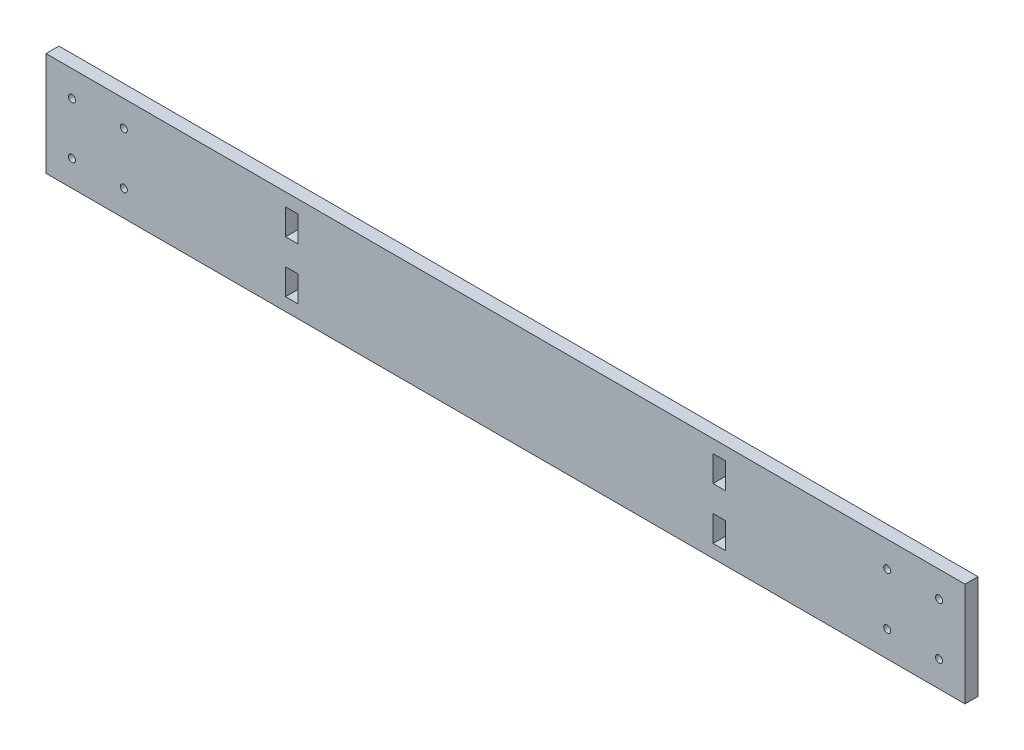
ISO-10303-21;
HEADER;
FILE_DESCRIPTION(('STEP AP214'),'2;1');
FILE_NAME('part.step','',(''),(''),'','','');
FILE_SCHEMA(('AUTOMOTIVE_DESIGN { 1 0 10303 214 1 1 1 1 }'));
ENDSEC;
DATA;
#1=APPLICATION_CONTEXT('core data for automotive mechanical design processes');
#2=APPLICATION_PROTOCOL_DEFINITION('international standard','automotive_design',2000,#1);
#3=PRODUCT_CONTEXT('',#1,'mechanical');
#4=PRODUCT('Part','Part','',(#3));
#5=PRODUCT_RELATED_PRODUCT_CATEGORY('part','',(#4));
#6=PRODUCT_DEFINITION_FORMATION('','',#4);
#7=PRODUCT_DEFINITION_CONTEXT('part definition',#1,'design');
#8=PRODUCT_DEFINITION('design','',#6,#7);
#9=PRODUCT_DEFINITION_SHAPE('','',#8);
#10=(LENGTH_UNIT() NAMED_UNIT(*) SI_UNIT(.MILLI.,.METRE.));
#11=(NAMED_UNIT(*) PLANE_ANGLE_UNIT() SI_UNIT($,.RADIAN.));
#12=(NAMED_UNIT(*) SI_UNIT($,.STERADIAN.) SOLID_ANGLE_UNIT());
#13=UNCERTAINTY_MEASURE_WITH_UNIT(LENGTH_MEASURE(1.E-05),#10,'distance_accuracy_value','');
#14=(GEOMETRIC_REPRESENTATION_CONTEXT(3) GLOBAL_UNCERTAINTY_ASSIGNED_CONTEXT((#13)) GLOBAL_UNIT_ASSIGNED_CONTEXT((#10,
#11,#12)) REPRESENTATION_CONTEXT('',''));
#15=CARTESIAN_POINT('',(0.,0.,0.));
#16=DIRECTION('',(0.,0.,1.));
#17=DIRECTION('',(1.,0.,0.));
#18=AXIS2_PLACEMENT_3D('',#15,#16,#17);
#19=CARTESIAN_POINT('',(-225.02495,-25.4,3.175));
#20=DIRECTION('',(1.,0.,0.));
#21=DIRECTION('',(0.,0.,-1.));
#22=AXIS2_PLACEMENT_3D('',#19,#20,#21);
#23=PLANE('',#22);
#24=DIRECTION('',(0.,-1.,0.));
#25=VECTOR('',#24,1.);
#26=CARTESIAN_POINT('',(-225.02495,-25.4,-3.175));
#27=LINE('',#26,#25);
#28=CARTESIAN_POINT('',(-225.02495,25.4,-3.175));
#29=VERTEX_POINT('',#28);
#30=CARTESIAN_POINT('',(-225.02495,-25.4,-3.175));
#31=VERTEX_POINT('',#30);
#32=EDGE_CURVE('E351',#29,#31,#27,.T.);
#33=ORIENTED_EDGE('',*,*,#32,.T.);
#34=DIRECTION('',(0.,0.,-1.));
#35=VECTOR('',#34,1.);
#36=CARTESIAN_POINT('',(-225.02495,-25.4,3.175));
#37=LINE('',#36,#35);
#38=CARTESIAN_POINT('',(-225.02495,-25.4,3.175));
#39=VERTEX_POINT('',#38);
#40=EDGE_CURVE('E11',#39,#31,#37,.T.);
#41=ORIENTED_EDGE('',*,*,#40,.F.);
#42=DIRECTION('',(0.,-1.,0.));
#43=VECTOR('',#42,1.);
#44=CARTESIAN_POINT('',(-225.02495,-25.4,3.175));
#45=LINE('',#44,#43);
#46=CARTESIAN_POINT('',(-225.02495,25.4,3.175));
#47=VERTEX_POINT('',#46);
#48=EDGE_CURVE('E352',#47,#39,#45,.T.);
#49=ORIENTED_EDGE('',*,*,#48,.F.);
#50=DIRECTION('',(0.,0.,-1.));
#51=VECTOR('',#50,1.);
#52=CARTESIAN_POINT('',(-225.02495,25.4,3.175));
#53=LINE('',#52,#51);
#54=EDGE_CURVE('E362',#47,#29,#53,.T.);
#55=ORIENTED_EDGE('',*,*,#54,.T.);
#56=EDGE_LOOP('',(#33,#41,#49,#55));
#57=FACE_BOUND('',#56,.T.);
#58=ADVANCED_FACE('F35',(#57),#23,.F.);
#59=CARTESIAN_POINT('',(225.02495,-25.4,3.175));
#60=DIRECTION('',(0.,1.,0.));
#61=DIRECTION('',(-1.,0.,0.));
#62=AXIS2_PLACEMENT_3D('',#59,#60,#61);
#63=PLANE('',#62);
#64=DIRECTION('',(1.,0.,0.));
#65=VECTOR('',#64,1.);
#66=CARTESIAN_POINT('',(225.02495,-25.4,-3.175));
#67=LINE('',#66,#65);
#68=CARTESIAN_POINT('',(225.02495,-25.4,-3.175));
#69=VERTEX_POINT('',#68);
#70=EDGE_CURVE('E365',#31,#69,#67,.T.);
#71=ORIENTED_EDGE('',*,*,#70,.T.);
#72=DIRECTION('',(0.,0.,-1.));
#73=VECTOR('',#72,1.);
#74=CARTESIAN_POINT('',(225.02495,-25.4,3.175));
#75=LINE('',#74,#73);
#76=CARTESIAN_POINT('',(225.02495,-25.4,3.175));
#77=VERTEX_POINT('',#76);
#78=EDGE_CURVE('E42',#77,#69,#75,.T.);
#79=ORIENTED_EDGE('',*,*,#78,.F.);
#80=DIRECTION('',(1.,0.,0.));
#81=VECTOR('',#80,1.);
#82=CARTESIAN_POINT('',(225.02495,-25.4,3.175));
#83=LINE('',#82,#81);
#84=EDGE_CURVE('E355',#39,#77,#83,.T.);
#85=ORIENTED_EDGE('',*,*,#84,.F.);
#86=ORIENTED_EDGE('',*,*,#40,.T.);
#87=EDGE_LOOP('',(#71,#79,#85,#86));
#88=FACE_BOUND('',#87,.T.);
#89=ADVANCED_FACE('F394',(#88),#63,.F.);
#90=CARTESIAN_POINT('',(225.02495,-25.4,3.175));
#91=DIRECTION('',(-1.,0.,0.));
#92=DIRECTION('',(0.,0.,1.));
#93=AXIS2_PLACEMENT_3D('',#90,#91,#92);
#94=PLANE('',#93);
#95=DIRECTION('',(0.,1.,0.));
#96=VECTOR('',#95,1.);
#97=CARTESIAN_POINT('',(225.02495,-25.4,-3.175));
#98=LINE('',#97,#96);
#99=CARTESIAN_POINT('',(225.02495,25.4,-3.175));
#100=VERTEX_POINT('',#99);
#101=EDGE_CURVE('E367',#69,#100,#98,.T.);
#102=ORIENTED_EDGE('',*,*,#101,.T.);
#103=DIRECTION('',(0.,0.,-1.));
#104=VECTOR('',#103,1.);
#105=CARTESIAN_POINT('',(225.02495,25.4,3.175));
#106=LINE('',#105,#104);
#107=CARTESIAN_POINT('',(225.02495,25.4,3.175));
#108=VERTEX_POINT('',#107);
#109=EDGE_CURVE('E372',#108,#100,#106,.T.);
#110=ORIENTED_EDGE('',*,*,#109,.F.);
#111=DIRECTION('',(0.,1.,0.));
#112=VECTOR('',#111,1.);
#113=CARTESIAN_POINT('',(225.02495,-25.4,3.175));
#114=LINE('',#113,#112);
#115=EDGE_CURVE('E358',#77,#108,#114,.T.);
#116=ORIENTED_EDGE('',*,*,#115,.F.);
#117=ORIENTED_EDGE('',*,*,#78,.T.);
#118=EDGE_LOOP('',(#102,#110,#116,#117));
#119=FACE_BOUND('',#118,.T.);
#120=ADVANCED_FACE('F379',(#119),#94,.F.);
#121=CARTESIAN_POINT('',(225.02495,25.4,3.175));
#122=DIRECTION('',(0.,-1.,0.));
#123=DIRECTION('',(1.,0.,0.));
#124=AXIS2_PLACEMENT_3D('',#121,#122,#123);
#125=PLANE('',#124);
#126=DIRECTION('',(-1.,0.,0.));
#127=VECTOR('',#126,1.);
#128=CARTESIAN_POINT('',(225.02495,25.4,-3.175));
#129=LINE('',#128,#127);
#130=EDGE_CURVE('E356',#100,#29,#129,.T.);
#131=ORIENTED_EDGE('',*,*,#130,.T.);
#132=ORIENTED_EDGE('',*,*,#54,.F.);
#133=DIRECTION('',(-1.,0.,0.));
#134=VECTOR('',#133,1.);
#135=CARTESIAN_POINT('',(225.02495,25.4,3.175));
#136=LINE('',#135,#134);
#137=EDGE_CURVE('E360',#108,#47,#136,.T.);
#138=ORIENTED_EDGE('',*,*,#137,.F.);
#139=ORIENTED_EDGE('',*,*,#109,.T.);
#140=EDGE_LOOP('',(#131,#132,#138,#139));
#141=FACE_BOUND('',#140,.T.);
#142=ADVANCED_FACE('F387',(#141),#125,.F.);
#143=CARTESIAN_POINT('',(0.,0.,3.175));
#144=DIRECTION('',(0.,0.,1.));
#145=DIRECTION('',(1.,0.,0.));
#146=AXIS2_PLACEMENT_3D('',#143,#144,#145);
#147=PLANE('',#146);
#148=DIRECTION('',(0.,-1.,0.));
#149=VECTOR('',#148,1.);
#150=CARTESIAN_POINT('',(101.6,-6.35,3.175));
#151=LINE('',#150,#149);
#152=CARTESIAN_POINT('',(101.6,-6.35,3.175));
#153=VERTEX_POINT('',#152);
#154=CARTESIAN_POINT('',(101.6,-19.05,3.175));
#155=VERTEX_POINT('',#154);
#156=EDGE_CURVE('E49',#153,#155,#151,.T.);
#157=ORIENTED_EDGE('',*,*,#156,.F.);
#158=DIRECTION('',(-1.,0.,0.));
#159=VECTOR('',#158,1.);
#160=CARTESIAN_POINT('',(101.6,-6.35,3.175));
#161=LINE('',#160,#159);
#162=CARTESIAN_POINT('',(107.696,-6.35,3.175));
#163=VERTEX_POINT('',#162);
#164=EDGE_CURVE('E189',#163,#153,#161,.T.);
#165=ORIENTED_EDGE('',*,*,#164,.F.);
#166=DIRECTION('',(0.,1.,0.));
#167=VECTOR('',#166,1.);
#168=CARTESIAN_POINT('',(107.696,-6.35,3.175));
#169=LINE('',#168,#167);
#170=CARTESIAN_POINT('',(107.696,-19.05,3.175));
#171=VERTEX_POINT('',#170);
#172=EDGE_CURVE('E192',#171,#163,#169,.T.);
#173=ORIENTED_EDGE('',*,*,#172,.F.);
#174=DIRECTION('',(1.,0.,0.));
#175=VECTOR('',#174,1.);
#176=CARTESIAN_POINT('',(101.6,-19.05,3.175));
#177=LINE('',#176,#175);
#178=EDGE_CURVE('E198',#155,#171,#177,.T.);
#179=ORIENTED_EDGE('',*,*,#178,.F.);
#180=EDGE_LOOP('',(#157,#165,#173,#179));
#181=FACE_BOUND('',#180,.T.);
#182=DIRECTION('',(1.,0.,0.));
#183=VECTOR('',#182,1.);
#184=CARTESIAN_POINT('',(107.696,6.35,3.175));
#185=LINE('',#184,#183);
#186=CARTESIAN_POINT('',(101.6,6.35,3.175));
#187=VERTEX_POINT('',#186);
#188=CARTESIAN_POINT('',(107.696,6.35,3.175));
#189=VERTEX_POINT('',#188);
#190=EDGE_CURVE('E204',#187,#189,#185,.T.);
#191=ORIENTED_EDGE('',*,*,#190,.F.);
#192=DIRECTION('',(0.,-1.,0.));
#193=VECTOR('',#192,1.);
#194=CARTESIAN_POINT('',(101.6,6.35,3.175));
#195=LINE('',#194,#193);
#196=CARTESIAN_POINT('',(101.6,19.05,3.175));
#197=VERTEX_POINT('',#196);
#198=EDGE_CURVE('E212',#197,#187,#195,.T.);
#199=ORIENTED_EDGE('',*,*,#198,.F.);
#200=DIRECTION('',(-1.,0.,0.));
#201=VECTOR('',#200,1.);
#202=CARTESIAN_POINT('',(107.696,19.05,3.175));
#203=LINE('',#202,#201);
#204=CARTESIAN_POINT('',(107.696,19.05,3.175));
#205=VERTEX_POINT('',#204);
#206=EDGE_CURVE('E226',#205,#197,#203,.T.);
#207=ORIENTED_EDGE('',*,*,#206,.F.);
#208=DIRECTION('',(0.,1.,0.));
#209=VECTOR('',#208,1.);
#210=CARTESIAN_POINT('',(107.696,6.35,3.175));
#211=LINE('',#210,#209);
#212=EDGE_CURVE('E223',#189,#205,#211,.T.);
#213=ORIENTED_EDGE('',*,*,#212,.F.);
#214=EDGE_LOOP('',(#191,#199,#207,#213));
#215=FACE_BOUND('',#214,.T.);
#216=DIRECTION('',(0.,1.,0.));
#217=VECTOR('',#216,1.);
#218=CARTESIAN_POINT('',(-101.6,-6.35,3.175));
#219=LINE('',#218,#217);
#220=CARTESIAN_POINT('',(-101.6,-19.05,3.175));
#221=VERTEX_POINT('',#220);
#222=CARTESIAN_POINT('',(-101.6,-6.35,3.175));
#223=VERTEX_POINT('',#222);
#224=EDGE_CURVE('E233',#221,#223,#219,.T.);
#225=ORIENTED_EDGE('',*,*,#224,.F.);
#226=DIRECTION('',(1.,0.,0.));
#227=VECTOR('',#226,1.);
#228=CARTESIAN_POINT('',(-101.6,-19.05,3.175));
#229=LINE('',#228,#227);
#230=CARTESIAN_POINT('',(-107.696,-19.05,3.175));
#231=VERTEX_POINT('',#230);
#232=EDGE_CURVE('E244',#231,#221,#229,.T.);
#233=ORIENTED_EDGE('',*,*,#232,.F.);
#234=DIRECTION('',(0.,-1.,0.));
#235=VECTOR('',#234,1.);
#236=CARTESIAN_POINT('',(-107.696,-6.35,3.175));
#237=LINE('',#236,#235);
#238=CARTESIAN_POINT('',(-107.696,-6.35,3.175));
#239=VERTEX_POINT('',#238);
#240=EDGE_CURVE('E258',#239,#231,#237,.T.);
#241=ORIENTED_EDGE('',*,*,#240,.F.);
#242=DIRECTION('',(-1.,0.,0.));
#243=VECTOR('',#242,1.);
#244=CARTESIAN_POINT('',(-101.6,-6.35,3.175));
#245=LINE('',#244,#243);
#246=EDGE_CURVE('E255',#223,#239,#245,.T.);
#247=ORIENTED_EDGE('',*,*,#246,.F.);
#248=EDGE_LOOP('',(#225,#233,#241,#247));
#249=FACE_BOUND('',#248,.T.);
#250=DIRECTION('',(0.,-1.,0.));
#251=VECTOR('',#250,1.);
#252=CARTESIAN_POINT('',(-107.696,6.35,3.175));
#253=LINE('',#252,#251);
#254=CARTESIAN_POINT('',(-107.696,19.05,3.175));
#255=VERTEX_POINT('',#254);
#256=CARTESIAN_POINT('',(-107.696,6.35,3.175));
#257=VERTEX_POINT('',#256);
#258=EDGE_CURVE('E265',#255,#257,#253,.T.);
#259=ORIENTED_EDGE('',*,*,#258,.F.);
#260=DIRECTION('',(-1.,0.,0.));
#261=VECTOR('',#260,1.);
#262=CARTESIAN_POINT('',(-107.696,19.05,3.175));
#263=LINE('',#262,#261);
#264=CARTESIAN_POINT('',(-101.6,19.05,3.175));
#265=VERTEX_POINT('',#264);
#266=EDGE_CURVE('E276',#265,#255,#263,.T.);
#267=ORIENTED_EDGE('',*,*,#266,.F.);
#268=DIRECTION('',(0.,1.,0.));
#269=VECTOR('',#268,1.);
#270=CARTESIAN_POINT('',(-101.6,6.35,3.175));
#271=LINE('',#270,#269);
#272=CARTESIAN_POINT('',(-101.6,6.35,3.175));
#273=VERTEX_POINT('',#272);
#274=EDGE_CURVE('E290',#273,#265,#271,.T.);
#275=ORIENTED_EDGE('',*,*,#274,.F.);
#276=DIRECTION('',(1.,0.,0.));
#277=VECTOR('',#276,1.);
#278=CARTESIAN_POINT('',(-107.696,6.35,3.175));
#279=LINE('',#278,#277);
#280=EDGE_CURVE('E287',#257,#273,#279,.T.);
#281=ORIENTED_EDGE('',*,*,#280,.F.);
#282=EDGE_LOOP('',(#259,#267,#275,#281));
#283=FACE_BOUND('',#282,.T.);
#284=CARTESIAN_POINT('',(-212.32495,12.7,3.175));
#285=DIRECTION('',(0.,0.,1.));
#286=DIRECTION('',(1.,0.,0.));
#287=AXIS2_PLACEMENT_3D('',#284,#285,#286);
#288=CIRCLE('',#287,1.72719999999998);
#289=CARTESIAN_POINT('',(-210.59775,12.7,3.175));
#290=VERTEX_POINT('',#289);
#291=EDGE_CURVE('E297',#290,#290,#288,.T.);
#292=ORIENTED_EDGE('',*,*,#291,.F.);
#293=EDGE_LOOP('',(#292));
#294=FACE_BOUND('',#293,.T.);
#295=CARTESIAN_POINT('',(-212.32495,-12.7,3.175));
#296=DIRECTION('',(0.,0.,1.));
#297=DIRECTION('',(1.,0.,0.));
#298=AXIS2_PLACEMENT_3D('',#295,#296,#297);
#299=CIRCLE('',#298,1.72719999999998);
#300=CARTESIAN_POINT('',(-210.59775,-12.7,3.175));
#301=VERTEX_POINT('',#300);
#302=EDGE_CURVE('E309',#301,#301,#299,.T.);
#303=ORIENTED_EDGE('',*,*,#302,.F.);
#304=EDGE_LOOP('',(#303));
#305=FACE_BOUND('',#304,.T.);
#306=CARTESIAN_POINT('',(212.32495,12.7,3.175));
#307=DIRECTION('',(0.,0.,1.));
#308=DIRECTION('',(1.,0.,0.));
#309=AXIS2_PLACEMENT_3D('',#306,#307,#308);
#310=CIRCLE('',#309,1.72719999999998);
#311=CARTESIAN_POINT('',(214.05215,12.7,3.175));
#312=VERTEX_POINT('',#311);
#313=EDGE_CURVE('E315',#312,#312,#310,.T.);
#314=ORIENTED_EDGE('',*,*,#313,.F.);
#315=EDGE_LOOP('',(#314));
#316=FACE_BOUND('',#315,.T.);
#317=CARTESIAN_POINT('',(212.32495,-12.7,3.175));
#318=DIRECTION('',(0.,0.,1.));
#319=DIRECTION('',(1.,0.,0.));
#320=AXIS2_PLACEMENT_3D('',#317,#318,#319);
#321=CIRCLE('',#320,1.72719999999998);
#322=CARTESIAN_POINT('',(214.05215,-12.7,3.175));
#323=VERTEX_POINT('',#322);
#324=EDGE_CURVE('E321',#323,#323,#321,.T.);
#325=ORIENTED_EDGE('',*,*,#324,.F.);
#326=EDGE_LOOP('',(#325));
#327=FACE_BOUND('',#326,.T.);
#328=CARTESIAN_POINT('',(-186.92495,12.7,3.175));
#329=DIRECTION('',(0.,0.,1.));
#330=DIRECTION('',(1.,0.,0.));
#331=AXIS2_PLACEMENT_3D('',#328,#329,#330);
#332=CIRCLE('',#331,1.72719999999998);
#333=CARTESIAN_POINT('',(-185.19775,12.7,3.175));
#334=VERTEX_POINT('',#333);
#335=EDGE_CURVE('E327',#334,#334,#332,.T.);
#336=ORIENTED_EDGE('',*,*,#335,.F.);
#337=EDGE_LOOP('',(#336));
#338=FACE_BOUND('',#337,.T.);
#339=CARTESIAN_POINT('',(-186.92495,-12.7,3.175));
#340=DIRECTION('',(0.,0.,1.));
#341=DIRECTION('',(1.,0.,0.));
#342=AXIS2_PLACEMENT_3D('',#339,#340,#341);
#343=CIRCLE('',#342,1.72719999999998);
#344=CARTESIAN_POINT('',(-185.19775,-12.7,3.175));
#345=VERTEX_POINT('',#344);
#346=EDGE_CURVE('E333',#345,#345,#343,.T.);
#347=ORIENTED_EDGE('',*,*,#346,.F.);
#348=EDGE_LOOP('',(#347));
#349=FACE_BOUND('',#348,.T.);
#350=CARTESIAN_POINT('',(186.92495,12.7,3.175));
#351=DIRECTION('',(0.,0.,1.));
#352=DIRECTION('',(1.,0.,0.));
#353=AXIS2_PLACEMENT_3D('',#350,#351,#352);
#354=CIRCLE('',#353,1.72719999999998);
#355=CARTESIAN_POINT('',(188.65215,12.7,3.175));
#356=VERTEX_POINT('',#355);
#357=EDGE_CURVE('E339',#356,#356,#354,.T.);
#358=ORIENTED_EDGE('',*,*,#357,.F.);
#359=EDGE_LOOP('',(#358));
#360=FACE_BOUND('',#359,.T.);
#361=CARTESIAN_POINT('',(186.92495,-12.7,3.175));
#362=DIRECTION('',(0.,0.,1.));
#363=DIRECTION('',(1.,0.,0.));
#364=AXIS2_PLACEMENT_3D('',#361,#362,#363);
#365=CIRCLE('',#364,1.72719999999998);
#366=CARTESIAN_POINT('',(188.65215,-12.7,3.175));
#367=VERTEX_POINT('',#366);
#368=EDGE_CURVE('E345',#367,#367,#365,.T.);
#369=ORIENTED_EDGE('',*,*,#368,.F.);
#370=EDGE_LOOP('',(#369));
#371=FACE_BOUND('',#370,.T.);
#372=ORIENTED_EDGE('',*,*,#48,.T.);
#373=ORIENTED_EDGE('',*,*,#84,.T.);
#374=ORIENTED_EDGE('',*,*,#115,.T.);
#375=ORIENTED_EDGE('',*,*,#137,.T.);
#376=EDGE_LOOP('',(#372,#373,#374,#375));
#377=FACE_BOUND('',#376,.T.);
#378=ADVANCED_FACE('F393',(#181,#215,#249,#283,#294,#305,#316,#327,#338,#349,#360,#371,#377),
#147,.T.);
#379=CARTESIAN_POINT('',(0.,0.,-3.175));
#380=DIRECTION('',(0.,0.,1.));
#381=DIRECTION('',(1.,0.,0.));
#382=AXIS2_PLACEMENT_3D('',#379,#380,#381);
#383=PLANE('',#382);
#384=DIRECTION('',(-1.,0.,0.));
#385=VECTOR('',#384,1.);
#386=CARTESIAN_POINT('',(101.6,-6.35,-3.175));
#387=LINE('',#386,#385);
#388=CARTESIAN_POINT('',(107.696,-6.35,-3.175));
#389=VERTEX_POINT('',#388);
#390=CARTESIAN_POINT('',(101.6,-6.35,-3.175));
#391=VERTEX_POINT('',#390);
#392=EDGE_CURVE('E179',#389,#391,#387,.T.);
#393=ORIENTED_EDGE('',*,*,#392,.T.);
#394=DIRECTION('',(0.,-1.,0.));
#395=VECTOR('',#394,1.);
#396=CARTESIAN_POINT('',(101.6,-6.35,-3.175));
#397=LINE('',#396,#395);
#398=CARTESIAN_POINT('',(101.6,-19.05,-3.175));
#399=VERTEX_POINT('',#398);
#400=EDGE_CURVE('E173',#391,#399,#397,.T.);
#401=ORIENTED_EDGE('',*,*,#400,.T.);
#402=DIRECTION('',(1.,0.,0.));
#403=VECTOR('',#402,1.);
#404=CARTESIAN_POINT('',(101.6,-19.05,-3.175));
#405=LINE('',#404,#403);
#406=CARTESIAN_POINT('',(107.696,-19.05,-3.175));
#407=VERTEX_POINT('',#406);
#408=EDGE_CURVE('E182',#399,#407,#405,.T.);
#409=ORIENTED_EDGE('',*,*,#408,.T.);
#410=DIRECTION('',(0.,1.,0.));
#411=VECTOR('',#410,1.);
#412=CARTESIAN_POINT('',(107.696,-6.35,-3.175));
#413=LINE('',#412,#411);
#414=EDGE_CURVE('E57',#407,#389,#413,.T.);
#415=ORIENTED_EDGE('',*,*,#414,.T.);
#416=EDGE_LOOP('',(#393,#401,#409,#415));
#417=FACE_BOUND('',#416,.T.);
#418=DIRECTION('',(0.,-1.,0.));
#419=VECTOR('',#418,1.);
#420=CARTESIAN_POINT('',(101.6,6.35,-3.175));
#421=LINE('',#420,#419);
#422=CARTESIAN_POINT('',(101.6,19.05,-3.175));
#423=VERTEX_POINT('',#422);
#424=CARTESIAN_POINT('',(101.6,6.35,-3.175));
#425=VERTEX_POINT('',#424);
#426=EDGE_CURVE('E218',#423,#425,#421,.T.);
#427=ORIENTED_EDGE('',*,*,#426,.T.);
#428=DIRECTION('',(1.,0.,0.));
#429=VECTOR('',#428,1.);
#430=CARTESIAN_POINT('',(107.696,6.35,-3.175));
#431=LINE('',#430,#429);
#432=CARTESIAN_POINT('',(107.696,6.35,-3.175));
#433=VERTEX_POINT('',#432);
#434=EDGE_CURVE('E208',#425,#433,#431,.T.);
#435=ORIENTED_EDGE('',*,*,#434,.T.);
#436=DIRECTION('',(0.,1.,0.));
#437=VECTOR('',#436,1.);
#438=CARTESIAN_POINT('',(107.696,6.35,-3.175));
#439=LINE('',#438,#437);
#440=CARTESIAN_POINT('',(107.696,19.05,-3.175));
#441=VERTEX_POINT('',#440);
#442=EDGE_CURVE('E211',#433,#441,#439,.T.);
#443=ORIENTED_EDGE('',*,*,#442,.T.);
#444=DIRECTION('',(-1.,0.,0.));
#445=VECTOR('',#444,1.);
#446=CARTESIAN_POINT('',(107.696,19.05,-3.175));
#447=LINE('',#446,#445);
#448=EDGE_CURVE('E215',#441,#423,#447,.T.);
#449=ORIENTED_EDGE('',*,*,#448,.T.);
#450=EDGE_LOOP('',(#427,#435,#443,#449));
#451=FACE_BOUND('',#450,.T.);
#452=DIRECTION('',(1.,0.,0.));
#453=VECTOR('',#452,1.);
#454=CARTESIAN_POINT('',(-101.6,-19.05,-3.175));
#455=LINE('',#454,#453);
#456=CARTESIAN_POINT('',(-107.696,-19.05,-3.175));
#457=VERTEX_POINT('',#456);
#458=CARTESIAN_POINT('',(-101.6,-19.05,-3.175));
#459=VERTEX_POINT('',#458);
#460=EDGE_CURVE('E250',#457,#459,#455,.T.);
#461=ORIENTED_EDGE('',*,*,#460,.T.);
#462=DIRECTION('',(0.,1.,0.));
#463=VECTOR('',#462,1.);
#464=CARTESIAN_POINT('',(-101.6,-6.35,-3.175));
#465=LINE('',#464,#463);
#466=CARTESIAN_POINT('',(-101.6,-6.35,-3.175));
#467=VERTEX_POINT('',#466);
#468=EDGE_CURVE('E240',#459,#467,#465,.T.);
#469=ORIENTED_EDGE('',*,*,#468,.T.);
#470=DIRECTION('',(-1.,0.,0.));
#471=VECTOR('',#470,1.);
#472=CARTESIAN_POINT('',(-101.6,-6.35,-3.175));
#473=LINE('',#472,#471);
#474=CARTESIAN_POINT('',(-107.696,-6.35,-3.175));
#475=VERTEX_POINT('',#474);
#476=EDGE_CURVE('E243',#467,#475,#473,.T.);
#477=ORIENTED_EDGE('',*,*,#476,.T.);
#478=DIRECTION('',(0.,-1.,0.));
#479=VECTOR('',#478,1.);
#480=CARTESIAN_POINT('',(-107.696,-6.35,-3.175));
#481=LINE('',#480,#479);
#482=EDGE_CURVE('E247',#475,#457,#481,.T.);
#483=ORIENTED_EDGE('',*,*,#482,.T.);
#484=EDGE_LOOP('',(#461,#469,#477,#483));
#485=FACE_BOUND('',#484,.T.);
#486=DIRECTION('',(-1.,0.,0.));
#487=VECTOR('',#486,1.);
#488=CARTESIAN_POINT('',(-107.696,19.05,-3.175));
#489=LINE('',#488,#487);
#490=CARTESIAN_POINT('',(-101.6,19.05,-3.175));
#491=VERTEX_POINT('',#490);
#492=CARTESIAN_POINT('',(-107.696,19.05,-3.175));
#493=VERTEX_POINT('',#492);
#494=EDGE_CURVE('E282',#491,#493,#489,.T.);
#495=ORIENTED_EDGE('',*,*,#494,.T.);
#496=DIRECTION('',(0.,-1.,0.));
#497=VECTOR('',#496,1.);
#498=CARTESIAN_POINT('',(-107.696,6.35,-3.175));
#499=LINE('',#498,#497);
#500=CARTESIAN_POINT('',(-107.696,6.35,-3.175));
#501=VERTEX_POINT('',#500);
#502=EDGE_CURVE('E272',#493,#501,#499,.T.);
#503=ORIENTED_EDGE('',*,*,#502,.T.);
#504=DIRECTION('',(1.,0.,0.));
#505=VECTOR('',#504,1.);
#506=CARTESIAN_POINT('',(-107.696,6.35,-3.175));
#507=LINE('',#506,#505);
#508=CARTESIAN_POINT('',(-101.6,6.35,-3.175));
#509=VERTEX_POINT('',#508);
#510=EDGE_CURVE('E275',#501,#509,#507,.T.);
#511=ORIENTED_EDGE('',*,*,#510,.T.);
#512=DIRECTION('',(0.,1.,0.));
#513=VECTOR('',#512,1.);
#514=CARTESIAN_POINT('',(-101.6,6.35,-3.175));
#515=LINE('',#514,#513);
#516=EDGE_CURVE('E279',#509,#491,#515,.T.);
#517=ORIENTED_EDGE('',*,*,#516,.T.);
#518=EDGE_LOOP('',(#495,#503,#511,#517));
#519=FACE_BOUND('',#518,.T.);
#520=CARTESIAN_POINT('',(-212.32495,12.7,-3.175));
#521=DIRECTION('',(0.,0.,1.));
#522=DIRECTION('',(1.,0.,0.));
#523=AXIS2_PLACEMENT_3D('',#520,#521,#522);
#524=CIRCLE('',#523,1.72719999999998);
#525=CARTESIAN_POINT('',(-210.59775,12.7,-3.175));
#526=VERTEX_POINT('',#525);
#527=EDGE_CURVE('E306',#526,#526,#524,.T.);
#528=ORIENTED_EDGE('',*,*,#527,.T.);
#529=EDGE_LOOP('',(#528));
#530=FACE_BOUND('',#529,.T.);
#531=CARTESIAN_POINT('',(-212.32495,-12.7,-3.175));
#532=DIRECTION('',(0.,0.,1.));
#533=DIRECTION('',(1.,0.,0.));
#534=AXIS2_PLACEMENT_3D('',#531,#532,#533);
#535=CIRCLE('',#534,1.72719999999998);
#536=CARTESIAN_POINT('',(-210.59775,-12.7,-3.175));
#537=VERTEX_POINT('',#536);
#538=EDGE_CURVE('E312',#537,#537,#535,.T.);
#539=ORIENTED_EDGE('',*,*,#538,.T.);
#540=EDGE_LOOP('',(#539));
#541=FACE_BOUND('',#540,.T.);
#542=CARTESIAN_POINT('',(212.32495,12.7,-3.175));
#543=DIRECTION('',(0.,0.,1.));
#544=DIRECTION('',(1.,0.,0.));
#545=AXIS2_PLACEMENT_3D('',#542,#543,#544);
#546=CIRCLE('',#545,1.72719999999998);
#547=CARTESIAN_POINT('',(214.05215,12.7,-3.175));
#548=VERTEX_POINT('',#547);
#549=EDGE_CURVE('E318',#548,#548,#546,.T.);
#550=ORIENTED_EDGE('',*,*,#549,.T.);
#551=EDGE_LOOP('',(#550));
#552=FACE_BOUND('',#551,.T.);
#553=CARTESIAN_POINT('',(212.32495,-12.7,-3.175));
#554=DIRECTION('',(0.,0.,1.));
#555=DIRECTION('',(1.,0.,0.));
#556=AXIS2_PLACEMENT_3D('',#553,#554,#555);
#557=CIRCLE('',#556,1.72719999999998);
#558=CARTESIAN_POINT('',(214.05215,-12.7,-3.175));
#559=VERTEX_POINT('',#558);
#560=EDGE_CURVE('E324',#559,#559,#557,.T.);
#561=ORIENTED_EDGE('',*,*,#560,.T.);
#562=EDGE_LOOP('',(#561));
#563=FACE_BOUND('',#562,.T.);
#564=CARTESIAN_POINT('',(-186.92495,12.7,-3.175));
#565=DIRECTION('',(0.,0.,1.));
#566=DIRECTION('',(1.,0.,0.));
#567=AXIS2_PLACEMENT_3D('',#564,#565,#566);
#568=CIRCLE('',#567,1.72719999999998);
#569=CARTESIAN_POINT('',(-185.19775,12.7,-3.175));
#570=VERTEX_POINT('',#569);
#571=EDGE_CURVE('E330',#570,#570,#568,.T.);
#572=ORIENTED_EDGE('',*,*,#571,.T.);
#573=EDGE_LOOP('',(#572));
#574=FACE_BOUND('',#573,.T.);
#575=CARTESIAN_POINT('',(-186.92495,-12.7,-3.175));
#576=DIRECTION('',(0.,0.,1.));
#577=DIRECTION('',(1.,0.,0.));
#578=AXIS2_PLACEMENT_3D('',#575,#576,#577);
#579=CIRCLE('',#578,1.72719999999998);
#580=CARTESIAN_POINT('',(-185.19775,-12.7,-3.175));
#581=VERTEX_POINT('',#580);
#582=EDGE_CURVE('E336',#581,#581,#579,.T.);
#583=ORIENTED_EDGE('',*,*,#582,.T.);
#584=EDGE_LOOP('',(#583));
#585=FACE_BOUND('',#584,.T.);
#586=CARTESIAN_POINT('',(186.92495,12.7,-3.175));
#587=DIRECTION('',(0.,0.,1.));
#588=DIRECTION('',(1.,0.,0.));
#589=AXIS2_PLACEMENT_3D('',#586,#587,#588);
#590=CIRCLE('',#589,1.72719999999998);
#591=CARTESIAN_POINT('',(188.65215,12.7,-3.175));
#592=VERTEX_POINT('',#591);
#593=EDGE_CURVE('E342',#592,#592,#590,.T.);
#594=ORIENTED_EDGE('',*,*,#593,.T.);
#595=EDGE_LOOP('',(#594));
#596=FACE_BOUND('',#595,.T.);
#597=CARTESIAN_POINT('',(186.92495,-12.7,-3.175));
#598=DIRECTION('',(0.,0.,1.));
#599=DIRECTION('',(1.,0.,0.));
#600=AXIS2_PLACEMENT_3D('',#597,#598,#599);
#601=CIRCLE('',#600,1.72719999999998);
#602=CARTESIAN_POINT('',(188.65215,-12.7,-3.175));
#603=VERTEX_POINT('',#602);
#604=EDGE_CURVE('E348',#603,#603,#601,.T.);
#605=ORIENTED_EDGE('',*,*,#604,.T.);
#606=EDGE_LOOP('',(#605));
#607=FACE_BOUND('',#606,.T.);
#608=ORIENTED_EDGE('',*,*,#32,.F.);
#609=ORIENTED_EDGE('',*,*,#130,.F.);
#610=ORIENTED_EDGE('',*,*,#101,.F.);
#611=ORIENTED_EDGE('',*,*,#70,.F.);
#612=EDGE_LOOP('',(#608,#609,#610,#611));
#613=FACE_BOUND('',#612,.T.);
#614=ADVANCED_FACE('F186',(#417,#451,#485,#519,#530,#541,#552,#563,#574,#585,#596,#607,#613),
#383,.F.);
#615=CARTESIAN_POINT('',(186.92495,-12.7,3.175));
#616=DIRECTION('',(0.,0.,1.));
#617=DIRECTION('',(1.,0.,0.));
#618=AXIS2_PLACEMENT_3D('',#615,#616,#617);
#619=CYLINDRICAL_SURFACE('',#618,1.72719999999998);
#620=ORIENTED_EDGE('',*,*,#604,.F.);
#621=EDGE_LOOP('',(#620));
#622=FACE_BOUND('',#621,.T.);
#623=ORIENTED_EDGE('',*,*,#368,.T.);
#624=EDGE_LOOP('',(#623));
#625=FACE_BOUND('',#624,.T.);
#626=ADVANCED_FACE('F406',(#622,#625),#619,.F.);
#627=CARTESIAN_POINT('',(186.92495,12.7,3.175));
#628=DIRECTION('',(0.,0.,1.));
#629=DIRECTION('',(1.,0.,0.));
#630=AXIS2_PLACEMENT_3D('',#627,#628,#629);
#631=CYLINDRICAL_SURFACE('',#630,1.72719999999998);
#632=ORIENTED_EDGE('',*,*,#593,.F.);
#633=EDGE_LOOP('',(#632));
#634=FACE_BOUND('',#633,.T.);
#635=ORIENTED_EDGE('',*,*,#357,.T.);
#636=EDGE_LOOP('',(#635));
#637=FACE_BOUND('',#636,.T.);
#638=ADVANCED_FACE('F412',(#634,#637),#631,.F.);
#639=CARTESIAN_POINT('',(-186.92495,-12.7,3.175));
#640=DIRECTION('',(0.,0.,1.));
#641=DIRECTION('',(1.,0.,0.));
#642=AXIS2_PLACEMENT_3D('',#639,#640,#641);
#643=CYLINDRICAL_SURFACE('',#642,1.72719999999998);
#644=ORIENTED_EDGE('',*,*,#582,.F.);
#645=EDGE_LOOP('',(#644));
#646=FACE_BOUND('',#645,.T.);
#647=ORIENTED_EDGE('',*,*,#346,.T.);
#648=EDGE_LOOP('',(#647));
#649=FACE_BOUND('',#648,.T.);
#650=ADVANCED_FACE('F416',(#646,#649),#643,.F.);
#651=CARTESIAN_POINT('',(-186.92495,12.7,3.175));
#652=DIRECTION('',(0.,0.,1.));
#653=DIRECTION('',(1.,0.,0.));
#654=AXIS2_PLACEMENT_3D('',#651,#652,#653);
#655=CYLINDRICAL_SURFACE('',#654,1.72719999999998);
#656=ORIENTED_EDGE('',*,*,#571,.F.);
#657=EDGE_LOOP('',(#656));
#658=FACE_BOUND('',#657,.T.);
#659=ORIENTED_EDGE('',*,*,#335,.T.);
#660=EDGE_LOOP('',(#659));
#661=FACE_BOUND('',#660,.T.);
#662=ADVANCED_FACE('F420',(#658,#661),#655,.F.);
#663=CARTESIAN_POINT('',(212.32495,-12.7,3.175));
#664=DIRECTION('',(0.,0.,1.));
#665=DIRECTION('',(1.,0.,0.));
#666=AXIS2_PLACEMENT_3D('',#663,#664,#665);
#667=CYLINDRICAL_SURFACE('',#666,1.72719999999998);
#668=ORIENTED_EDGE('',*,*,#560,.F.);
#669=EDGE_LOOP('',(#668));
#670=FACE_BOUND('',#669,.T.);
#671=ORIENTED_EDGE('',*,*,#324,.T.);
#672=EDGE_LOOP('',(#671));
#673=FACE_BOUND('',#672,.T.);
#674=ADVANCED_FACE('F424',(#670,#673),#667,.F.);
#675=CARTESIAN_POINT('',(212.32495,12.7,3.175));
#676=DIRECTION('',(0.,0.,1.));
#677=DIRECTION('',(1.,0.,0.));
#678=AXIS2_PLACEMENT_3D('',#675,#676,#677);
#679=CYLINDRICAL_SURFACE('',#678,1.72719999999998);
#680=ORIENTED_EDGE('',*,*,#549,.F.);
#681=EDGE_LOOP('',(#680));
#682=FACE_BOUND('',#681,.T.);
#683=ORIENTED_EDGE('',*,*,#313,.T.);
#684=EDGE_LOOP('',(#683));
#685=FACE_BOUND('',#684,.T.);
#686=ADVANCED_FACE('F428',(#682,#685),#679,.F.);
#687=CARTESIAN_POINT('',(-212.32495,-12.7,3.175));
#688=DIRECTION('',(0.,0.,1.));
#689=DIRECTION('',(1.,0.,0.));
#690=AXIS2_PLACEMENT_3D('',#687,#688,#689);
#691=CYLINDRICAL_SURFACE('',#690,1.72719999999998);
#692=ORIENTED_EDGE('',*,*,#538,.F.);
#693=EDGE_LOOP('',(#692));
#694=FACE_BOUND('',#693,.T.);
#695=ORIENTED_EDGE('',*,*,#302,.T.);
#696=EDGE_LOOP('',(#695));
#697=FACE_BOUND('',#696,.T.);
#698=ADVANCED_FACE('F432',(#694,#697),#691,.F.);
#699=CARTESIAN_POINT('',(-212.32495,12.7,3.175));
#700=DIRECTION('',(0.,0.,1.));
#701=DIRECTION('',(1.,0.,0.));
#702=AXIS2_PLACEMENT_3D('',#699,#700,#701);
#703=CYLINDRICAL_SURFACE('',#702,1.72719999999998);
#704=ORIENTED_EDGE('',*,*,#527,.F.);
#705=EDGE_LOOP('',(#704));
#706=FACE_BOUND('',#705,.T.);
#707=ORIENTED_EDGE('',*,*,#291,.T.);
#708=EDGE_LOOP('',(#707));
#709=FACE_BOUND('',#708,.T.);
#710=ADVANCED_FACE('F436',(#706,#709),#703,.F.);
#711=CARTESIAN_POINT('',(-107.696,6.35,-3.175));
#712=DIRECTION('',(-1.,0.,0.));
#713=DIRECTION('',(0.,0.,1.));
#714=AXIS2_PLACEMENT_3D('',#711,#712,#713);
#715=PLANE('',#714);
#716=ORIENTED_EDGE('',*,*,#258,.T.);
#717=DIRECTION('',(0.,0.,1.));
#718=VECTOR('',#717,1.);
#719=CARTESIAN_POINT('',(-107.696,6.35,-3.175));
#720=LINE('',#719,#718);
#721=EDGE_CURVE('E285',#501,#257,#720,.T.);
#722=ORIENTED_EDGE('',*,*,#721,.F.);
#723=ORIENTED_EDGE('',*,*,#502,.F.);
#724=DIRECTION('',(0.,0.,1.));
#725=VECTOR('',#724,1.);
#726=CARTESIAN_POINT('',(-107.696,19.05,-3.175));
#727=LINE('',#726,#725);
#728=EDGE_CURVE('E295',#493,#255,#727,.T.);
#729=ORIENTED_EDGE('',*,*,#728,.T.);
#730=EDGE_LOOP('',(#716,#722,#723,#729));
#731=FACE_BOUND('',#730,.T.);
#732=ADVANCED_FACE('F440',(#731),#715,.F.);
#733=CARTESIAN_POINT('',(-107.696,19.05,-3.175));
#734=DIRECTION('',(0.,1.,0.));
#735=DIRECTION('',(0.,0.,1.));
#736=AXIS2_PLACEMENT_3D('',#733,#734,#735);
#737=PLANE('',#736);
#738=ORIENTED_EDGE('',*,*,#266,.T.);
#739=ORIENTED_EDGE('',*,*,#728,.F.);
#740=ORIENTED_EDGE('',*,*,#494,.F.);
#741=DIRECTION('',(0.,0.,1.));
#742=VECTOR('',#741,1.);
#743=CARTESIAN_POINT('',(-101.6,19.05,-3.175));
#744=LINE('',#743,#742);
#745=EDGE_CURVE('E298',#491,#265,#744,.T.);
#746=ORIENTED_EDGE('',*,*,#745,.T.);
#747=EDGE_LOOP('',(#738,#739,#740,#746));
#748=FACE_BOUND('',#747,.T.);
#749=ADVANCED_FACE('F444',(#748),#737,.F.);
#750=CARTESIAN_POINT('',(-101.6,6.35,-3.175));
#751=DIRECTION('',(1.,0.,0.));
#752=DIRECTION('',(0.,1.,0.));
#753=AXIS2_PLACEMENT_3D('',#750,#751,#752);
#754=PLANE('',#753);
#755=ORIENTED_EDGE('',*,*,#274,.T.);
#756=ORIENTED_EDGE('',*,*,#745,.F.);
#757=ORIENTED_EDGE('',*,*,#516,.F.);
#758=DIRECTION('',(0.,0.,1.));
#759=VECTOR('',#758,1.);
#760=CARTESIAN_POINT('',(-101.6,6.35,-3.175));
#761=LINE('',#760,#759);
#762=EDGE_CURVE('E300',#509,#273,#761,.T.);
#763=ORIENTED_EDGE('',*,*,#762,.T.);
#764=EDGE_LOOP('',(#755,#756,#757,#763));
#765=FACE_BOUND('',#764,.T.);
#766=ADVANCED_FACE('F450',(#765),#754,.F.);
#767=CARTESIAN_POINT('',(-107.696,6.35,-3.175));
#768=DIRECTION('',(0.,-1.,0.));
#769=DIRECTION('',(0.,0.,-1.));
#770=AXIS2_PLACEMENT_3D('',#767,#768,#769);
#771=PLANE('',#770);
#772=ORIENTED_EDGE('',*,*,#280,.T.);
#773=ORIENTED_EDGE('',*,*,#762,.F.);
#774=ORIENTED_EDGE('',*,*,#510,.F.);
#775=ORIENTED_EDGE('',*,*,#721,.T.);
#776=EDGE_LOOP('',(#772,#773,#774,#775));
#777=FACE_BOUND('',#776,.T.);
#778=ADVANCED_FACE('F446',(#777),#771,.F.);
#779=CARTESIAN_POINT('',(-101.6,-6.35,-3.175));
#780=DIRECTION('',(1.,0.,0.));
#781=DIRECTION('',(0.,1.,0.));
#782=AXIS2_PLACEMENT_3D('',#779,#780,#781);
#783=PLANE('',#782);
#784=ORIENTED_EDGE('',*,*,#224,.T.);
#785=DIRECTION('',(0.,0.,1.));
#786=VECTOR('',#785,1.);
#787=CARTESIAN_POINT('',(-101.6,-6.35,-3.175));
#788=LINE('',#787,#786);
#789=EDGE_CURVE('E253',#467,#223,#788,.T.);
#790=ORIENTED_EDGE('',*,*,#789,.F.);
#791=ORIENTED_EDGE('',*,*,#468,.F.);
#792=DIRECTION('',(0.,0.,1.));
#793=VECTOR('',#792,1.);
#794=CARTESIAN_POINT('',(-101.6,-19.05,-3.175));
#795=LINE('',#794,#793);
#796=EDGE_CURVE('E263',#459,#221,#795,.T.);
#797=ORIENTED_EDGE('',*,*,#796,.T.);
#798=EDGE_LOOP('',(#784,#790,#791,#797));
#799=FACE_BOUND('',#798,.T.);
#800=ADVANCED_FACE('F449',(#799),#783,.F.);
#801=CARTESIAN_POINT('',(-101.6,-19.05,-3.175));
#802=DIRECTION('',(0.,-1.,0.));
#803=DIRECTION('',(0.,0.,-1.));
#804=AXIS2_PLACEMENT_3D('',#801,#802,#803);
#805=PLANE('',#804);
#806=ORIENTED_EDGE('',*,*,#232,.T.);
#807=ORIENTED_EDGE('',*,*,#796,.F.);
#808=ORIENTED_EDGE('',*,*,#460,.F.);
#809=DIRECTION('',(0.,0.,1.));
#810=VECTOR('',#809,1.);
#811=CARTESIAN_POINT('',(-107.696,-19.05,-3.175));
#812=LINE('',#811,#810);
#813=EDGE_CURVE('E266',#457,#231,#812,.T.);
#814=ORIENTED_EDGE('',*,*,#813,.T.);
#815=EDGE_LOOP('',(#806,#807,#808,#814));
#816=FACE_BOUND('',#815,.T.);
#817=ADVANCED_FACE('F460',(#816),#805,.F.);
#818=CARTESIAN_POINT('',(-107.696,-6.35,-3.175));
#819=DIRECTION('',(-1.,0.,0.));
#820=DIRECTION('',(0.,-1.,0.));
#821=AXIS2_PLACEMENT_3D('',#818,#819,#820);
#822=PLANE('',#821);
#823=ORIENTED_EDGE('',*,*,#240,.T.);
#824=ORIENTED_EDGE('',*,*,#813,.F.);
#825=ORIENTED_EDGE('',*,*,#482,.F.);
#826=DIRECTION('',(0.,0.,1.));
#827=VECTOR('',#826,1.);
#828=CARTESIAN_POINT('',(-107.696,-6.35,-3.175));
#829=LINE('',#828,#827);
#830=EDGE_CURVE('E268',#475,#239,#829,.T.);
#831=ORIENTED_EDGE('',*,*,#830,.T.);
#832=EDGE_LOOP('',(#823,#824,#825,#831));
#833=FACE_BOUND('',#832,.T.);
#834=ADVANCED_FACE('F466',(#833),#822,.F.);
#835=CARTESIAN_POINT('',(-101.6,-6.35,-3.175));
#836=DIRECTION('',(0.,1.,0.));
#837=DIRECTION('',(0.,0.,1.));
#838=AXIS2_PLACEMENT_3D('',#835,#836,#837);
#839=PLANE('',#838);
#840=ORIENTED_EDGE('',*,*,#246,.T.);
#841=ORIENTED_EDGE('',*,*,#830,.F.);
#842=ORIENTED_EDGE('',*,*,#476,.F.);
#843=ORIENTED_EDGE('',*,*,#789,.T.);
#844=EDGE_LOOP('',(#840,#841,#842,#843));
#845=FACE_BOUND('',#844,.T.);
#846=ADVANCED_FACE('F462',(#845),#839,.F.);
#847=CARTESIAN_POINT('',(107.696,6.35,-3.175));
#848=DIRECTION('',(0.,-1.,0.));
#849=DIRECTION('',(0.,0.,-1.));
#850=AXIS2_PLACEMENT_3D('',#847,#848,#849);
#851=PLANE('',#850);
#852=ORIENTED_EDGE('',*,*,#190,.T.);
#853=DIRECTION('',(0.,0.,1.));
#854=VECTOR('',#853,1.);
#855=CARTESIAN_POINT('',(107.696,6.35,-3.175));
#856=LINE('',#855,#854);
#857=EDGE_CURVE('E221',#433,#189,#856,.T.);
#858=ORIENTED_EDGE('',*,*,#857,.F.);
#859=ORIENTED_EDGE('',*,*,#434,.F.);
#860=DIRECTION('',(0.,0.,1.));
#861=VECTOR('',#860,1.);
#862=CARTESIAN_POINT('',(101.6,6.35,-3.175));
#863=LINE('',#862,#861);
#864=EDGE_CURVE('E231',#425,#187,#863,.T.);
#865=ORIENTED_EDGE('',*,*,#864,.T.);
#866=EDGE_LOOP('',(#852,#858,#859,#865));
#867=FACE_BOUND('',#866,.T.);
#868=ADVANCED_FACE('F465',(#867),#851,.F.);
#869=CARTESIAN_POINT('',(101.6,6.35,-3.175));
#870=DIRECTION('',(-1.,0.,0.));
#871=DIRECTION('',(0.,-1.,0.));
#872=AXIS2_PLACEMENT_3D('',#869,#870,#871);
#873=PLANE('',#872);
#874=ORIENTED_EDGE('',*,*,#198,.T.);
#875=ORIENTED_EDGE('',*,*,#864,.F.);
#876=ORIENTED_EDGE('',*,*,#426,.F.);
#877=DIRECTION('',(0.,0.,1.));
#878=VECTOR('',#877,1.);
#879=CARTESIAN_POINT('',(101.6,19.05,-3.175));
#880=LINE('',#879,#878);
#881=EDGE_CURVE('E234',#423,#197,#880,.T.);
#882=ORIENTED_EDGE('',*,*,#881,.T.);
#883=EDGE_LOOP('',(#874,#875,#876,#882));
#884=FACE_BOUND('',#883,.T.);
#885=ADVANCED_FACE('F476',(#884),#873,.F.);
#886=CARTESIAN_POINT('',(107.696,19.05,-3.175));
#887=DIRECTION('',(0.,1.,0.));
#888=DIRECTION('',(0.,0.,1.));
#889=AXIS2_PLACEMENT_3D('',#886,#887,#888);
#890=PLANE('',#889);
#891=ORIENTED_EDGE('',*,*,#206,.T.);
#892=ORIENTED_EDGE('',*,*,#881,.F.);
#893=ORIENTED_EDGE('',*,*,#448,.F.);
#894=DIRECTION('',(0.,0.,1.));
#895=VECTOR('',#894,1.);
#896=CARTESIAN_POINT('',(107.696,19.05,-3.175));
#897=LINE('',#896,#895);
#898=EDGE_CURVE('E236',#441,#205,#897,.T.);
#899=ORIENTED_EDGE('',*,*,#898,.T.);
#900=EDGE_LOOP('',(#891,#892,#893,#899));
#901=FACE_BOUND('',#900,.T.);
#902=ADVANCED_FACE('F481',(#901),#890,.F.);
#903=CARTESIAN_POINT('',(107.696,6.35,-3.175));
#904=DIRECTION('',(1.,0.,0.));
#905=DIRECTION('',(0.,0.,-1.));
#906=AXIS2_PLACEMENT_3D('',#903,#904,#905);
#907=PLANE('',#906);
#908=ORIENTED_EDGE('',*,*,#212,.T.);
#909=ORIENTED_EDGE('',*,*,#898,.F.);
#910=ORIENTED_EDGE('',*,*,#442,.F.);
#911=ORIENTED_EDGE('',*,*,#857,.T.);
#912=EDGE_LOOP('',(#908,#909,#910,#911));
#913=FACE_BOUND('',#912,.T.);
#914=ADVANCED_FACE('F478',(#913),#907,.F.);
#915=CARTESIAN_POINT('',(101.6,-6.35,-3.175));
#916=DIRECTION('',(-1.,0.,0.));
#917=DIRECTION('',(0.,-1.,0.));
#918=AXIS2_PLACEMENT_3D('',#915,#916,#917);
#919=PLANE('',#918);
#920=ORIENTED_EDGE('',*,*,#156,.T.);
#921=DIRECTION('',(0.,0.,1.));
#922=VECTOR('',#921,1.);
#923=CARTESIAN_POINT('',(101.6,-19.05,-3.175));
#924=LINE('',#923,#922);
#925=EDGE_CURVE('E169',#399,#155,#924,.T.);
#926=ORIENTED_EDGE('',*,*,#925,.F.);
#927=ORIENTED_EDGE('',*,*,#400,.F.);
#928=DIRECTION('',(0.,0.,1.));
#929=VECTOR('',#928,1.);
#930=CARTESIAN_POINT('',(101.6,-6.35,-3.175));
#931=LINE('',#930,#929);
#932=EDGE_CURVE('E202',#391,#153,#931,.T.);
#933=ORIENTED_EDGE('',*,*,#932,.T.);
#934=EDGE_LOOP('',(#920,#926,#927,#933));
#935=FACE_BOUND('',#934,.T.);
#936=ADVANCED_FACE('F171',(#935),#919,.F.);
#937=CARTESIAN_POINT('',(101.6,-6.35,-3.175));
#938=DIRECTION('',(0.,1.,0.));
#939=DIRECTION('',(0.,0.,1.));
#940=AXIS2_PLACEMENT_3D('',#937,#938,#939);
#941=PLANE('',#940);
#942=ORIENTED_EDGE('',*,*,#164,.T.);
#943=ORIENTED_EDGE('',*,*,#932,.F.);
#944=ORIENTED_EDGE('',*,*,#392,.F.);
#945=DIRECTION('',(0.,0.,1.));
#946=VECTOR('',#945,1.);
#947=CARTESIAN_POINT('',(107.696,-6.35,-3.175));
#948=LINE('',#947,#946);
#949=EDGE_CURVE('E205',#389,#163,#948,.T.);
#950=ORIENTED_EDGE('',*,*,#949,.T.);
#951=EDGE_LOOP('',(#942,#943,#944,#950));
#952=FACE_BOUND('',#951,.T.);
#953=ADVANCED_FACE('F491',(#952),#941,.F.);
#954=CARTESIAN_POINT('',(107.696,-6.35,-3.175));
#955=DIRECTION('',(1.,0.,0.));
#956=DIRECTION('',(0.,1.,0.));
#957=AXIS2_PLACEMENT_3D('',#954,#955,#956);
#958=PLANE('',#957);
#959=ORIENTED_EDGE('',*,*,#172,.T.);
#960=ORIENTED_EDGE('',*,*,#949,.F.);
#961=ORIENTED_EDGE('',*,*,#414,.F.);
#962=DIRECTION('',(0.,0.,1.));
#963=VECTOR('',#962,1.);
#964=CARTESIAN_POINT('',(107.696,-19.05,-3.175));
#965=LINE('',#964,#963);
#966=EDGE_CURVE('E178',#407,#171,#965,.T.);
#967=ORIENTED_EDGE('',*,*,#966,.T.);
#968=EDGE_LOOP('',(#959,#960,#961,#967));
#969=FACE_BOUND('',#968,.T.);
#970=ADVANCED_FACE('F494',(#969),#958,.F.);
#971=CARTESIAN_POINT('',(101.6,-19.05,-3.175));
#972=DIRECTION('',(0.,-1.,0.));
#973=DIRECTION('',(0.,0.,-1.));
#974=AXIS2_PLACEMENT_3D('',#971,#972,#973);
#975=PLANE('',#974);
#976=ORIENTED_EDGE('',*,*,#178,.T.);
#977=ORIENTED_EDGE('',*,*,#966,.F.);
#978=ORIENTED_EDGE('',*,*,#408,.F.);
#979=ORIENTED_EDGE('',*,*,#925,.T.);
#980=EDGE_LOOP('',(#976,#977,#978,#979));
#981=FACE_BOUND('',#980,.T.);
#982=ADVANCED_FACE('F183',(#981),#975,.F.);
#983=CLOSED_SHELL('',(#58,#89,#120,#142,#378,#614,#626,#638,#650,#662,#674,#686,#698,#710,#732,
#749,#766,#778,#800,#817,#834,#846,#868,#885,#902,#914,#936,#953,#970,#982));
#984=MANIFOLD_SOLID_BREP('B2',#983);
#985=ADVANCED_BREP_SHAPE_REPRESENTATION('',(#18,#984),#14);
#986=SHAPE_DEFINITION_REPRESENTATION(#9,#985);
ENDSEC;
END-ISO-10303-21;
